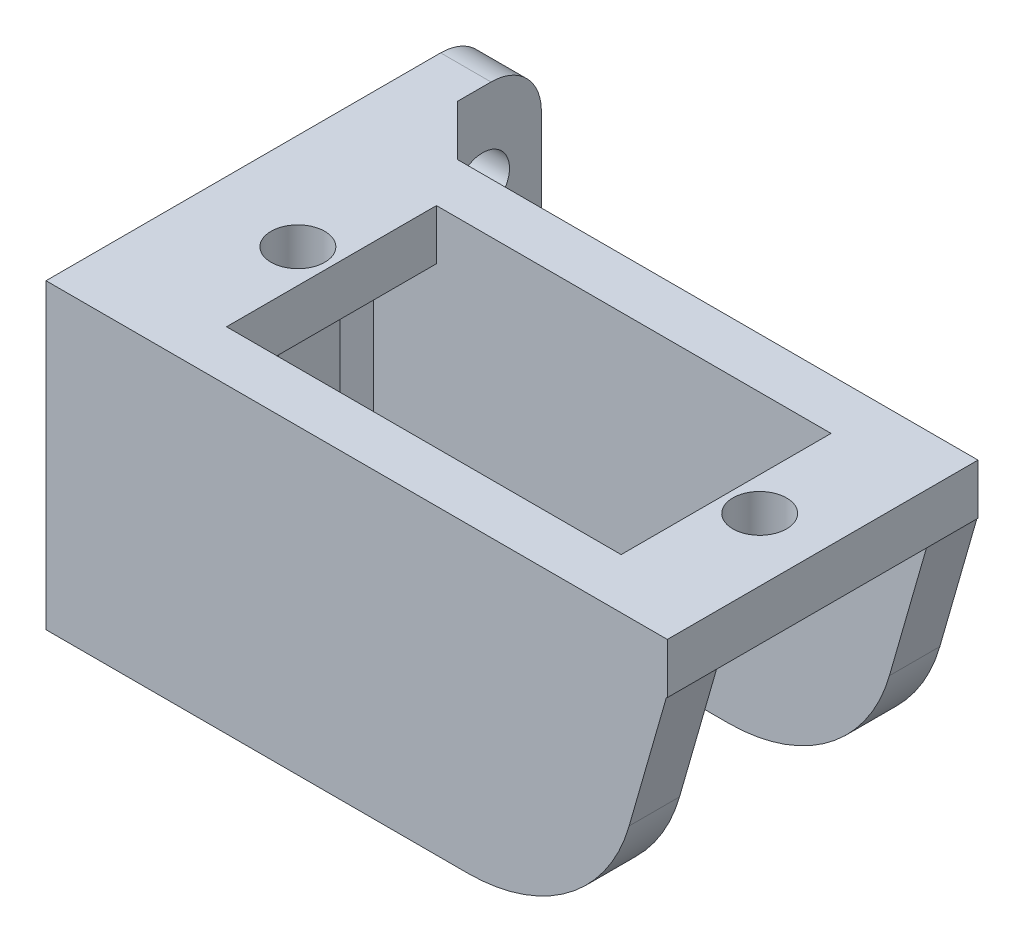
ISO-10303-21;
HEADER;
FILE_DESCRIPTION(('STEP AP214'),'2;1');
FILE_NAME('part.step','',(''),(''),'','','');
FILE_SCHEMA(('AUTOMOTIVE_DESIGN { 1 0 10303 214 1 1 1 1 }'));
ENDSEC;
DATA;
#1=APPLICATION_CONTEXT('core data for automotive mechanical design processes');
#2=APPLICATION_PROTOCOL_DEFINITION('international standard','automotive_design',2000,#1);
#3=PRODUCT_CONTEXT('',#1,'mechanical');
#4=PRODUCT('Part','Part','',(#3));
#5=PRODUCT_RELATED_PRODUCT_CATEGORY('part','',(#4));
#6=PRODUCT_DEFINITION_FORMATION('','',#4);
#7=PRODUCT_DEFINITION_CONTEXT('part definition',#1,'design');
#8=PRODUCT_DEFINITION('design','',#6,#7);
#9=PRODUCT_DEFINITION_SHAPE('','',#8);
#10=(LENGTH_UNIT() NAMED_UNIT(*) SI_UNIT(.MILLI.,.METRE.));
#11=(NAMED_UNIT(*) PLANE_ANGLE_UNIT() SI_UNIT($,.RADIAN.));
#12=(NAMED_UNIT(*) SI_UNIT($,.STERADIAN.) SOLID_ANGLE_UNIT());
#13=UNCERTAINTY_MEASURE_WITH_UNIT(LENGTH_MEASURE(1.E-05),#10,'distance_accuracy_value','');
#14=(GEOMETRIC_REPRESENTATION_CONTEXT(3) GLOBAL_UNCERTAINTY_ASSIGNED_CONTEXT((#13)) GLOBAL_UNIT_ASSIGNED_CONTEXT((#10,
#11,#12)) REPRESENTATION_CONTEXT('',''));
#15=CARTESIAN_POINT('',(0.,0.,0.));
#16=DIRECTION('',(0.,0.,1.));
#17=DIRECTION('',(1.,0.,0.));
#18=AXIS2_PLACEMENT_3D('',#15,#16,#17);
#19=CARTESIAN_POINT('',(0.999999999999997,3.,-21.5));
#20=DIRECTION('',(0.707106781186551,0.,-0.707106781186544));
#21=DIRECTION('',(0.,1.,0.));
#22=AXIS2_PLACEMENT_3D('',#19,#20,#21);
#23=PLANE('',#22);
#24=CARTESIAN_POINT('',(-0.499999999999959,-2.,-23.));
#25=DIRECTION('',(0.707106781186551,0.,-0.707106781186544));
#26=DIRECTION('',(-0.707106781186544,0.,-0.707106781186551));
#27=AXIS2_PLACEMENT_3D('',#24,#25,#26);
#28=ELLIPSE('',#27,3.53553390593272,2.5);
#29=CARTESIAN_POINT('',(0.999999999999997,0.,-21.5));
#30=VERTEX_POINT('',#29);
#31=CARTESIAN_POINT('',(0.999999999999997,-4.00000000000002,-21.5));
#32=VERTEX_POINT('',#31);
#33=EDGE_CURVE('E214',#30,#32,#28,.T.);
#34=ORIENTED_EDGE('',*,*,#33,.F.);
#35=DIRECTION('',(0.,-1.,0.));
#36=VECTOR('',#35,1.);
#37=CARTESIAN_POINT('',(0.999999999999997,-15.,-21.5));
#38=LINE('',#37,#36);
#39=CARTESIAN_POINT('',(0.999999999999997,3.,-21.5));
#40=VERTEX_POINT('',#39);
#41=EDGE_CURVE('E225',#40,#30,#38,.T.);
#42=ORIENTED_EDGE('',*,*,#41,.F.);
#43=DIRECTION('',(0.707106781186544,0.,0.707106781186551));
#44=VECTOR('',#43,1.);
#45=CARTESIAN_POINT('',(11.25,3.,-11.2499999999999));
#46=LINE('',#45,#44);
#47=CARTESIAN_POINT('',(4.,3.,-18.5));
#48=VERTEX_POINT('',#47);
#49=EDGE_CURVE('E391',#48,#40,#46,.F.);
#50=ORIENTED_EDGE('',*,*,#49,.F.);
#51=DIRECTION('',(0.,1.,0.));
#52=VECTOR('',#51,1.);
#53=CARTESIAN_POINT('',(4.,3.,-18.5));
#54=LINE('',#53,#52);
#55=CARTESIAN_POINT('',(4.,-15.,-18.5));
#56=VERTEX_POINT('',#55);
#57=EDGE_CURVE('E237',#56,#48,#54,.T.);
#58=ORIENTED_EDGE('',*,*,#57,.F.);
#59=DIRECTION('',(-0.707106781186544,0.,-0.707106781186551));
#60=VECTOR('',#59,1.);
#61=CARTESIAN_POINT('',(11.25,-15.,-11.2499999999999));
#62=LINE('',#61,#60);
#63=CARTESIAN_POINT('',(0.999999999999997,-15.,-21.5));
#64=VERTEX_POINT('',#63);
#65=EDGE_CURVE('E240',#64,#56,#62,.F.);
#66=ORIENTED_EDGE('',*,*,#65,.F.);
#67=CARTESIAN_POINT('',(0.999999999999997,-12.,-21.5));
#68=VERTEX_POINT('',#67);
#69=EDGE_CURVE('E239',#68,#64,#38,.T.);
#70=ORIENTED_EDGE('',*,*,#69,.F.);
#71=CARTESIAN_POINT('',(-0.499999999999959,-10.,-23.));
#72=DIRECTION('',(0.707106781186551,0.,-0.707106781186544));
#73=DIRECTION('',(-0.707106781186544,0.,-0.707106781186551));
#74=AXIS2_PLACEMENT_3D('',#71,#72,#73);
#75=ELLIPSE('',#74,3.53553390593272,2.5);
#76=CARTESIAN_POINT('',(0.999999999999997,-7.99999999999998,-21.5));
#77=VERTEX_POINT('',#76);
#78=EDGE_CURVE('E229',#77,#68,#75,.T.);
#79=ORIENTED_EDGE('',*,*,#78,.F.);
#80=EDGE_CURVE('E227',#32,#77,#38,.T.);
#81=ORIENTED_EDGE('',*,*,#80,.F.);
#82=EDGE_LOOP('',(#34,#42,#50,#58,#66,#70,#79,#81));
#83=FACE_BOUND('',#82,.T.);
#84=ADVANCED_FACE('F43',(#83),#23,.T.);
#85=CARTESIAN_POINT('',(-2.,-10.,-23.));
#86=DIRECTION('',(1.,0.,0.));
#87=DIRECTION('',(0.,0.,-1.));
#88=AXIS2_PLACEMENT_3D('',#85,#86,#87);
#89=CYLINDRICAL_SURFACE('',#88,1.6);
#90=CARTESIAN_POINT('',(-2.,-10.,-23.));
#91=DIRECTION('',(1.,0.,0.));
#92=DIRECTION('',(0.,0.,-1.));
#93=AXIS2_PLACEMENT_3D('',#90,#91,#92);
#94=CIRCLE('',#93,1.6);
#95=CARTESIAN_POINT('',(-2.,-10.,-24.6));
#96=VERTEX_POINT('',#95);
#97=EDGE_CURVE('E219',#96,#96,#94,.T.);
#98=ORIENTED_EDGE('',*,*,#97,.F.);
#99=EDGE_LOOP('',(#98));
#100=FACE_BOUND('',#99,.T.);
#101=CARTESIAN_POINT('',(0.999999999999997,-10.,-23.));
#102=DIRECTION('',(-1.,0.,0.));
#103=DIRECTION('',(0.,0.,1.));
#104=AXIS2_PLACEMENT_3D('',#101,#102,#103);
#105=CIRCLE('',#104,1.6);
#106=CARTESIAN_POINT('',(0.999999999999997,-10.,-21.4));
#107=VERTEX_POINT('',#106);
#108=EDGE_CURVE('E380',#107,#107,#105,.T.);
#109=ORIENTED_EDGE('',*,*,#108,.F.);
#110=EDGE_LOOP('',(#109));
#111=FACE_BOUND('',#110,.T.);
#112=ADVANCED_FACE('F475',(#100,#111),#89,.F.);
#113=CARTESIAN_POINT('',(-2.,-2.,-23.));
#114=DIRECTION('',(1.,0.,0.));
#115=DIRECTION('',(0.,0.,-1.));
#116=AXIS2_PLACEMENT_3D('',#113,#114,#115);
#117=CYLINDRICAL_SURFACE('',#116,1.6);
#118=CARTESIAN_POINT('',(-2.,-2.,-23.));
#119=DIRECTION('',(1.,0.,0.));
#120=DIRECTION('',(0.,0.,-1.));
#121=AXIS2_PLACEMENT_3D('',#118,#119,#120);
#122=CIRCLE('',#121,1.6);
#123=CARTESIAN_POINT('',(-2.,-2.,-24.6));
#124=VERTEX_POINT('',#123);
#125=EDGE_CURVE('E383',#124,#124,#122,.T.);
#126=ORIENTED_EDGE('',*,*,#125,.F.);
#127=EDGE_LOOP('',(#126));
#128=FACE_BOUND('',#127,.T.);
#129=CARTESIAN_POINT('',(0.999999999999997,-2.,-23.));
#130=DIRECTION('',(-1.,0.,0.));
#131=DIRECTION('',(0.,0.,1.));
#132=AXIS2_PLACEMENT_3D('',#129,#130,#131);
#133=CIRCLE('',#132,1.6);
#134=CARTESIAN_POINT('',(0.999999999999997,-2.,-21.4));
#135=VERTEX_POINT('',#134);
#136=EDGE_CURVE('E377',#135,#135,#133,.T.);
#137=ORIENTED_EDGE('',*,*,#136,.F.);
#138=EDGE_LOOP('',(#137));
#139=FACE_BOUND('',#138,.T.);
#140=ADVANCED_FACE('F481',(#128,#139),#117,.F.);
#141=CARTESIAN_POINT('',(0.,3.,-18.5));
#142=DIRECTION('',(0.,0.,1.));
#143=DIRECTION('',(1.,0.,0.));
#144=AXIS2_PLACEMENT_3D('',#141,#142,#143);
#145=PLANE('',#144);
#146=DIRECTION('',(-0.275637355816996,-0.96126169593832,0.));
#147=VECTOR('',#146,1.);
#148=CARTESIAN_POINT('',(33.0895193766835,-6.48826699824057,-18.5));
#149=LINE('',#148,#147);
#150=CARTESIAN_POINT('',(34.9500000000001,0.,-18.5));
#151=VERTEX_POINT('',#150);
#152=CARTESIAN_POINT('',(32.7258956719733,-7.75637355816996,-18.5));
#153=VERTEX_POINT('',#152);
#154=EDGE_CURVE('E254',#151,#153,#149,.T.);
#155=ORIENTED_EDGE('',*,*,#154,.T.);
#156=CARTESIAN_POINT('',(23.1132787125901,-5.,-18.5));
#157=DIRECTION('',(0.,0.,1.));
#158=DIRECTION('',(1.,0.,0.));
#159=AXIS2_PLACEMENT_3D('',#156,#157,#158);
#160=CIRCLE('',#159,10.);
#161=CARTESIAN_POINT('',(23.1132787125901,-15.,-18.5));
#162=VERTEX_POINT('',#161);
#163=EDGE_CURVE('E423',#153,#162,#160,.F.);
#164=ORIENTED_EDGE('',*,*,#163,.T.);
#165=DIRECTION('',(1.,0.,0.));
#166=VECTOR('',#165,1.);
#167=CARTESIAN_POINT('',(29.25,-15.,-18.5));
#168=LINE('',#167,#166);
#169=EDGE_CURVE('E336',#56,#162,#168,.T.);
#170=ORIENTED_EDGE('',*,*,#169,.F.);
#171=ORIENTED_EDGE('',*,*,#57,.T.);
#172=DIRECTION('',(-1.,0.,0.));
#173=VECTOR('',#172,1.);
#174=CARTESIAN_POINT('',(0.,3.,-18.5));
#175=LINE('',#174,#173);
#176=CARTESIAN_POINT('',(35.,3.,-18.5));
#177=VERTEX_POINT('',#176);
#178=EDGE_CURVE('E279',#177,#48,#175,.T.);
#179=ORIENTED_EDGE('',*,*,#178,.F.);
#180=DIRECTION('',(0.,-1.,0.));
#181=VECTOR('',#180,1.);
#182=CARTESIAN_POINT('',(35.,3.,-18.5));
#183=LINE('',#182,#181);
#184=CARTESIAN_POINT('',(35.,0.,-18.5));
#185=VERTEX_POINT('',#184);
#186=EDGE_CURVE('E276',#177,#185,#183,.T.);
#187=ORIENTED_EDGE('',*,*,#186,.T.);
#188=DIRECTION('',(-1.,0.,0.));
#189=VECTOR('',#188,1.);
#190=CARTESIAN_POINT('',(0.,0.,-18.5));
#191=LINE('',#190,#189);
#192=EDGE_CURVE('E280',#185,#151,#191,.T.);
#193=ORIENTED_EDGE('',*,*,#192,.T.);
#194=EDGE_LOOP('',(#155,#164,#170,#171,#179,#187,#193));
#195=FACE_BOUND('',#194,.T.);
#196=ADVANCED_FACE('F544',(#195),#145,.F.);
#197=CARTESIAN_POINT('',(0.,0.,0.));
#198=DIRECTION('',(0.,-1.,0.));
#199=DIRECTION('',(0.,0.,-1.));
#200=AXIS2_PLACEMENT_3D('',#197,#198,#199);
#201=PLANE('',#200);
#202=DIRECTION('',(0.,0.,-1.));
#203=VECTOR('',#202,1.);
#204=CARTESIAN_POINT('',(29.25,0.,-15.5));
#205=LINE('',#204,#203);
#206=CARTESIAN_POINT('',(29.25,0.,-3.));
#207=VERTEX_POINT('',#206);
#208=CARTESIAN_POINT('',(29.25,0.,-15.5));
#209=VERTEX_POINT('',#208);
#210=EDGE_CURVE('E298',#207,#209,#205,.T.);
#211=ORIENTED_EDGE('',*,*,#210,.T.);
#212=DIRECTION('',(1.,0.,0.));
#213=VECTOR('',#212,1.);
#214=CARTESIAN_POINT('',(0.,0.,-15.5));
#215=LINE('',#214,#213);
#216=CARTESIAN_POINT('',(34.9500000000001,0.,-15.5));
#217=VERTEX_POINT('',#216);
#218=EDGE_CURVE('E261',#209,#217,#215,.T.);
#219=ORIENTED_EDGE('',*,*,#218,.T.);
#220=DIRECTION('',(0.,0.,-1.));
#221=VECTOR('',#220,1.);
#222=CARTESIAN_POINT('',(34.9500000000001,0.,0.));
#223=LINE('',#222,#221);
#224=EDGE_CURVE('E264',#217,#151,#223,.T.);
#225=ORIENTED_EDGE('',*,*,#224,.T.);
#226=ORIENTED_EDGE('',*,*,#192,.F.);
#227=DIRECTION('',(0.,0.,-1.));
#228=VECTOR('',#227,1.);
#229=CARTESIAN_POINT('',(35.,0.,0.));
#230=LINE('',#229,#228);
#231=CARTESIAN_POINT('',(35.,0.,0.));
#232=VERTEX_POINT('',#231);
#233=EDGE_CURVE('E284',#232,#185,#230,.T.);
#234=ORIENTED_EDGE('',*,*,#233,.F.);
#235=DIRECTION('',(1.,0.,0.));
#236=VECTOR('',#235,1.);
#237=CARTESIAN_POINT('',(0.,0.,0.));
#238=LINE('',#237,#236);
#239=CARTESIAN_POINT('',(34.9500000000001,0.,0.));
#240=VERTEX_POINT('',#239);
#241=EDGE_CURVE('E286',#240,#232,#238,.T.);
#242=ORIENTED_EDGE('',*,*,#241,.F.);
#243=DIRECTION('',(0.,0.,-1.));
#244=VECTOR('',#243,1.);
#245=CARTESIAN_POINT('',(34.9500000000001,0.,0.));
#246=LINE('',#245,#244);
#247=CARTESIAN_POINT('',(34.9500000000001,0.,-3.));
#248=VERTEX_POINT('',#247);
#249=EDGE_CURVE('E267',#240,#248,#246,.T.);
#250=ORIENTED_EDGE('',*,*,#249,.T.);
#251=DIRECTION('',(-1.,0.,0.));
#252=VECTOR('',#251,1.);
#253=CARTESIAN_POINT('',(0.,0.,-3.));
#254=LINE('',#253,#252);
#255=EDGE_CURVE('E270',#248,#207,#254,.T.);
#256=ORIENTED_EDGE('',*,*,#255,.T.);
#257=EDGE_LOOP('',(#211,#219,#225,#226,#234,#242,#250,#256));
#258=FACE_BOUND('',#257,.T.);
#259=CARTESIAN_POINT('',(31.25,0.,-9.25));
#260=DIRECTION('',(0.,1.,0.));
#261=DIRECTION('',(0.,0.,1.));
#262=AXIS2_PLACEMENT_3D('',#259,#260,#261);
#263=CIRCLE('',#262,1.6);
#264=CARTESIAN_POINT('',(31.25,0.,-7.65));
#265=VERTEX_POINT('',#264);
#266=EDGE_CURVE('E320',#265,#265,#263,.T.);
#267=ORIENTED_EDGE('',*,*,#266,.T.);
#268=EDGE_LOOP('',(#267));
#269=FACE_BOUND('',#268,.T.);
#270=ADVANCED_FACE('F554',(#258,#269),#201,.T.);
#271=CARTESIAN_POINT('',(0.,3.,0.));
#272=DIRECTION('',(0.,0.,-1.));
#273=DIRECTION('',(-1.,0.,0.));
#274=AXIS2_PLACEMENT_3D('',#271,#272,#273);
#275=PLANE('',#274);
#276=DIRECTION('',(-1.,0.,0.));
#277=VECTOR('',#276,1.);
#278=CARTESIAN_POINT('',(29.25,-15.,0.));
#279=LINE('',#278,#277);
#280=CARTESIAN_POINT('',(23.1132787125901,-15.,0.));
#281=VERTEX_POINT('',#280);
#282=CARTESIAN_POINT('',(-2.,-15.,0.));
#283=VERTEX_POINT('',#282);
#284=EDGE_CURVE('E350',#281,#283,#279,.T.);
#285=ORIENTED_EDGE('',*,*,#284,.F.);
#286=CARTESIAN_POINT('',(23.1132787125901,-5.,0.));
#287=DIRECTION('',(0.,0.,-1.));
#288=DIRECTION('',(-1.,0.,0.));
#289=AXIS2_PLACEMENT_3D('',#286,#287,#288);
#290=CIRCLE('',#289,10.);
#291=CARTESIAN_POINT('',(32.7258956719733,-7.75637355816996,0.));
#292=VERTEX_POINT('',#291);
#293=EDGE_CURVE('E425',#281,#292,#290,.F.);
#294=ORIENTED_EDGE('',*,*,#293,.T.);
#295=DIRECTION('',(0.275637355816996,0.96126169593832,0.));
#296=VECTOR('',#295,1.);
#297=CARTESIAN_POINT('',(33.0895193766835,-6.48826699824057,0.));
#298=LINE('',#297,#296);
#299=EDGE_CURVE('E249',#292,#240,#298,.T.);
#300=ORIENTED_EDGE('',*,*,#299,.T.);
#301=ORIENTED_EDGE('',*,*,#241,.T.);
#302=DIRECTION('',(0.,-1.,0.));
#303=VECTOR('',#302,1.);
#304=CARTESIAN_POINT('',(35.,3.,0.));
#305=LINE('',#304,#303);
#306=CARTESIAN_POINT('',(35.,3.,0.));
#307=VERTEX_POINT('',#306);
#308=EDGE_CURVE('E273',#307,#232,#305,.T.);
#309=ORIENTED_EDGE('',*,*,#308,.F.);
#310=DIRECTION('',(1.,0.,0.));
#311=VECTOR('',#310,1.);
#312=CARTESIAN_POINT('',(0.,3.,0.));
#313=LINE('',#312,#311);
#314=CARTESIAN_POINT('',(-2.,3.,0.));
#315=VERTEX_POINT('',#314);
#316=EDGE_CURVE('E283',#315,#307,#313,.T.);
#317=ORIENTED_EDGE('',*,*,#316,.F.);
#318=DIRECTION('',(0.,1.,0.));
#319=VECTOR('',#318,1.);
#320=CARTESIAN_POINT('',(-2.,0.,0.));
#321=LINE('',#320,#319);
#322=EDGE_CURVE('E324',#283,#315,#321,.T.);
#323=ORIENTED_EDGE('',*,*,#322,.F.);
#324=EDGE_LOOP('',(#285,#294,#300,#301,#309,#317,#323));
#325=FACE_BOUND('',#324,.T.);
#326=ADVANCED_FACE('F520',(#325),#275,.F.);
#327=CARTESIAN_POINT('',(35.,3.,0.));
#328=DIRECTION('',(-1.,0.,0.));
#329=DIRECTION('',(0.,0.,1.));
#330=AXIS2_PLACEMENT_3D('',#327,#328,#329);
#331=PLANE('',#330);
#332=ORIENTED_EDGE('',*,*,#233,.T.);
#333=ORIENTED_EDGE('',*,*,#186,.F.);
#334=DIRECTION('',(0.,0.,-1.));
#335=VECTOR('',#334,1.);
#336=CARTESIAN_POINT('',(35.,3.,0.));
#337=LINE('',#336,#335);
#338=EDGE_CURVE('E291',#307,#177,#337,.T.);
#339=ORIENTED_EDGE('',*,*,#338,.F.);
#340=ORIENTED_EDGE('',*,*,#308,.T.);
#341=EDGE_LOOP('',(#332,#333,#339,#340));
#342=FACE_BOUND('',#341,.T.);
#343=ADVANCED_FACE('F568',(#342),#331,.F.);
#344=CARTESIAN_POINT('',(0.,3.,0.));
#345=DIRECTION('',(0.,-1.,0.));
#346=DIRECTION('',(0.,0.,-1.));
#347=AXIS2_PLACEMENT_3D('',#344,#345,#346);
#348=PLANE('',#347);
#349=CARTESIAN_POINT('',(31.25,3.,-9.25));
#350=DIRECTION('',(0.,1.,0.));
#351=DIRECTION('',(0.,0.,1.));
#352=AXIS2_PLACEMENT_3D('',#349,#350,#351);
#353=CIRCLE('',#352,1.6);
#354=CARTESIAN_POINT('',(31.25,3.,-7.65));
#355=VERTEX_POINT('',#354);
#356=EDGE_CURVE('E323',#355,#355,#353,.T.);
#357=ORIENTED_EDGE('',*,*,#356,.F.);
#358=EDGE_LOOP('',(#357));
#359=FACE_BOUND('',#358,.T.);
#360=CARTESIAN_POINT('',(3.75000000000001,3.,-9.25));
#361=DIRECTION('',(0.,1.,0.));
#362=DIRECTION('',(0.,0.,1.));
#363=AXIS2_PLACEMENT_3D('',#360,#361,#362);
#364=CIRCLE('',#363,1.6);
#365=CARTESIAN_POINT('',(3.75000000000001,3.,-7.65));
#366=VERTEX_POINT('',#365);
#367=EDGE_CURVE('E315',#366,#366,#364,.T.);
#368=ORIENTED_EDGE('',*,*,#367,.F.);
#369=EDGE_LOOP('',(#368));
#370=FACE_BOUND('',#369,.T.);
#371=DIRECTION('',(1.,0.,0.));
#372=VECTOR('',#371,1.);
#373=CARTESIAN_POINT('',(5.75,3.,-3.));
#374=LINE('',#373,#372);
#375=CARTESIAN_POINT('',(5.75,3.,-3.));
#376=VERTEX_POINT('',#375);
#377=CARTESIAN_POINT('',(29.25,3.,-3.));
#378=VERTEX_POINT('',#377);
#379=EDGE_CURVE('E310',#376,#378,#374,.T.);
#380=ORIENTED_EDGE('',*,*,#379,.F.);
#381=DIRECTION('',(0.,0.,1.));
#382=VECTOR('',#381,1.);
#383=CARTESIAN_POINT('',(5.75,3.,-15.5));
#384=LINE('',#383,#382);
#385=CARTESIAN_POINT('',(5.75,3.,-15.5));
#386=VERTEX_POINT('',#385);
#387=EDGE_CURVE('E313',#386,#376,#384,.T.);
#388=ORIENTED_EDGE('',*,*,#387,.F.);
#389=DIRECTION('',(-1.,0.,0.));
#390=VECTOR('',#389,1.);
#391=CARTESIAN_POINT('',(5.75,3.,-15.5));
#392=LINE('',#391,#390);
#393=CARTESIAN_POINT('',(29.25,3.,-15.5));
#394=VERTEX_POINT('',#393);
#395=EDGE_CURVE('E303',#394,#386,#392,.T.);
#396=ORIENTED_EDGE('',*,*,#395,.F.);
#397=DIRECTION('',(0.,0.,-1.));
#398=VECTOR('',#397,1.);
#399=CARTESIAN_POINT('',(29.25,3.,-15.5));
#400=LINE('',#399,#398);
#401=EDGE_CURVE('E307',#378,#394,#400,.T.);
#402=ORIENTED_EDGE('',*,*,#401,.F.);
#403=EDGE_LOOP('',(#380,#388,#396,#402));
#404=FACE_BOUND('',#403,.T.);
#405=DIRECTION('',(0.,0.,1.));
#406=VECTOR('',#405,1.);
#407=CARTESIAN_POINT('',(0.999999999999997,3.,-26.5));
#408=LINE('',#407,#406);
#409=CARTESIAN_POINT('',(0.999999999999997,3.,-23.5));
#410=VERTEX_POINT('',#409);
#411=EDGE_CURVE('E235',#410,#40,#408,.T.);
#412=ORIENTED_EDGE('',*,*,#411,.F.);
#413=DIRECTION('',(1.,0.,0.));
#414=VECTOR('',#413,1.);
#415=CARTESIAN_POINT('',(0.,3.,-23.5));
#416=LINE('',#415,#414);
#417=CARTESIAN_POINT('',(-2.,3.,-23.5));
#418=VERTEX_POINT('',#417);
#419=EDGE_CURVE('E411',#410,#418,#416,.F.);
#420=ORIENTED_EDGE('',*,*,#419,.T.);
#421=DIRECTION('',(0.,0.,1.));
#422=VECTOR('',#421,1.);
#423=CARTESIAN_POINT('',(-2.,3.,0.));
#424=LINE('',#423,#422);
#425=EDGE_CURVE('E334',#418,#315,#424,.T.);
#426=ORIENTED_EDGE('',*,*,#425,.T.);
#427=ORIENTED_EDGE('',*,*,#316,.T.);
#428=ORIENTED_EDGE('',*,*,#338,.T.);
#429=ORIENTED_EDGE('',*,*,#178,.T.);
#430=ORIENTED_EDGE('',*,*,#49,.T.);
#431=EDGE_LOOP('',(#412,#420,#426,#427,#428,#429,#430));
#432=FACE_BOUND('',#431,.T.);
#433=ADVANCED_FACE('F539',(#359,#370,#404,#432),#348,.F.);
#434=DIRECTION('',(0.,0.,1.));
#435=VECTOR('',#434,1.);
#436=CARTESIAN_POINT('',(1.,0.,-15.5));
#437=LINE('',#436,#435);
#438=CARTESIAN_POINT('',(1.,0.,-14.5));
#439=VERTEX_POINT('',#438);
#440=CARTESIAN_POINT('',(1.,0.,-4.00000000000001));
#441=VERTEX_POINT('',#440);
#442=EDGE_CURVE('E340',#439,#441,#437,.T.);
#443=ORIENTED_EDGE('',*,*,#442,.F.);
#444=DIRECTION('',(-0.707106781186545,0.,0.70710678118655));
#445=VECTOR('',#444,1.);
#446=CARTESIAN_POINT('',(-6.74999999999999,0.,-6.74999999999995));
#447=LINE('',#446,#445);
#448=CARTESIAN_POINT('',(1.99999999999999,0.,-15.5));
#449=VERTEX_POINT('',#448);
#450=EDGE_CURVE('E438',#439,#449,#447,.F.);
#451=ORIENTED_EDGE('',*,*,#450,.T.);
#452=DIRECTION('',(-1.,0.,0.));
#453=VECTOR('',#452,1.);
#454=CARTESIAN_POINT('',(29.25,0.,-15.5));
#455=LINE('',#454,#453);
#456=CARTESIAN_POINT('',(5.75,0.,-15.5));
#457=VERTEX_POINT('',#456);
#458=EDGE_CURVE('E272',#457,#449,#455,.T.);
#459=ORIENTED_EDGE('',*,*,#458,.F.);
#460=DIRECTION('',(0.,0.,1.));
#461=VECTOR('',#460,1.);
#462=CARTESIAN_POINT('',(5.75,0.,-15.5));
#463=LINE('',#462,#461);
#464=CARTESIAN_POINT('',(5.75,0.,-3.));
#465=VERTEX_POINT('',#464);
#466=EDGE_CURVE('E306',#457,#465,#463,.T.);
#467=ORIENTED_EDGE('',*,*,#466,.T.);
#468=DIRECTION('',(1.,0.,0.));
#469=VECTOR('',#468,1.);
#470=CARTESIAN_POINT('',(29.25,0.,-3.));
#471=LINE('',#470,#469);
#472=CARTESIAN_POINT('',(2.00000000000002,0.,-3.));
#473=VERTEX_POINT('',#472);
#474=EDGE_CURVE('E337',#473,#465,#471,.T.);
#475=ORIENTED_EDGE('',*,*,#474,.F.);
#476=DIRECTION('',(0.70710678118655,0.,0.707106781186545));
#477=VECTOR('',#476,1.);
#478=CARTESIAN_POINT('',(2.5,0.,-2.50000000000002));
#479=LINE('',#478,#477);
#480=EDGE_CURVE('E436',#473,#441,#479,.F.);
#481=ORIENTED_EDGE('',*,*,#480,.T.);
#482=EDGE_LOOP('',(#443,#451,#459,#467,#475,#481));
#483=FACE_BOUND('',#482,.T.);
#484=CARTESIAN_POINT('',(3.75000000000001,0.,-9.25));
#485=DIRECTION('',(0.,1.,0.));
#486=DIRECTION('',(0.,0.,1.));
#487=AXIS2_PLACEMENT_3D('',#484,#485,#486);
#488=CIRCLE('',#487,1.6);
#489=CARTESIAN_POINT('',(3.75000000000001,0.,-7.65));
#490=VERTEX_POINT('',#489);
#491=EDGE_CURVE('E327',#490,#490,#488,.T.);
#492=ORIENTED_EDGE('',*,*,#491,.T.);
#493=EDGE_LOOP('',(#492));
#494=FACE_BOUND('',#493,.T.);
#495=ADVANCED_FACE('F454',(#483,#494),#201,.T.);
#496=CARTESIAN_POINT('',(5.75,0.,-15.5));
#497=DIRECTION('',(-1.,0.,0.));
#498=DIRECTION('',(0.,0.,1.));
#499=AXIS2_PLACEMENT_3D('',#496,#497,#498);
#500=PLANE('',#499);
#501=ORIENTED_EDGE('',*,*,#387,.T.);
#502=DIRECTION('',(0.,1.,0.));
#503=VECTOR('',#502,1.);
#504=CARTESIAN_POINT('',(5.75,0.,-3.));
#505=LINE('',#504,#503);
#506=EDGE_CURVE('E294',#465,#376,#505,.T.);
#507=ORIENTED_EDGE('',*,*,#506,.F.);
#508=ORIENTED_EDGE('',*,*,#466,.F.);
#509=DIRECTION('',(0.,1.,0.));
#510=VECTOR('',#509,1.);
#511=CARTESIAN_POINT('',(5.75,0.,-15.5));
#512=LINE('',#511,#510);
#513=EDGE_CURVE('E288',#457,#386,#512,.T.);
#514=ORIENTED_EDGE('',*,*,#513,.T.);
#515=EDGE_LOOP('',(#501,#507,#508,#514));
#516=FACE_BOUND('',#515,.T.);
#517=ADVANCED_FACE('F463',(#516),#500,.F.);
#518=CARTESIAN_POINT('',(5.75,0.,-15.5));
#519=DIRECTION('',(0.,0.,-1.));
#520=DIRECTION('',(-1.,0.,0.));
#521=AXIS2_PLACEMENT_3D('',#518,#519,#520);
#522=PLANE('',#521);
#523=ORIENTED_EDGE('',*,*,#458,.T.);
#524=DIRECTION('',(0.,-1.,0.));
#525=VECTOR('',#524,1.);
#526=CARTESIAN_POINT('',(2.,-15.,-15.5));
#527=LINE('',#526,#525);
#528=CARTESIAN_POINT('',(1.99999999999999,-15.,-15.5));
#529=VERTEX_POINT('',#528);
#530=EDGE_CURVE('E65',#449,#529,#527,.T.);
#531=ORIENTED_EDGE('',*,*,#530,.T.);
#532=DIRECTION('',(-1.,0.,0.));
#533=VECTOR('',#532,1.);
#534=CARTESIAN_POINT('',(29.25,-15.,-15.5));
#535=LINE('',#534,#533);
#536=CARTESIAN_POINT('',(23.1132787125901,-15.,-15.5));
#537=VERTEX_POINT('',#536);
#538=EDGE_CURVE('E339',#537,#529,#535,.T.);
#539=ORIENTED_EDGE('',*,*,#538,.F.);
#540=CARTESIAN_POINT('',(23.1132787125901,-5.,-15.5));
#541=DIRECTION('',(0.,0.,-1.));
#542=DIRECTION('',(-1.,0.,0.));
#543=AXIS2_PLACEMENT_3D('',#540,#541,#542);
#544=CIRCLE('',#543,10.);
#545=CARTESIAN_POINT('',(32.7258956719733,-7.75637355816996,-15.5));
#546=VERTEX_POINT('',#545);
#547=EDGE_CURVE('E419',#537,#546,#544,.F.);
#548=ORIENTED_EDGE('',*,*,#547,.T.);
#549=DIRECTION('',(0.275637355816996,0.96126169593832,0.));
#550=VECTOR('',#549,1.);
#551=CARTESIAN_POINT('',(32.731502203884,-7.73682125780476,-15.5));
#552=LINE('',#551,#550);
#553=EDGE_CURVE('E259',#546,#217,#552,.T.);
#554=ORIENTED_EDGE('',*,*,#553,.T.);
#555=ORIENTED_EDGE('',*,*,#218,.F.);
#556=DIRECTION('',(0.,1.,0.));
#557=VECTOR('',#556,1.);
#558=CARTESIAN_POINT('',(29.25,0.,-15.5));
#559=LINE('',#558,#557);
#560=EDGE_CURVE('E300',#209,#394,#559,.T.);
#561=ORIENTED_EDGE('',*,*,#560,.T.);
#562=ORIENTED_EDGE('',*,*,#395,.T.);
#563=ORIENTED_EDGE('',*,*,#513,.F.);
#564=EDGE_LOOP('',(#523,#531,#539,#548,#554,#555,#561,#562,#563));
#565=FACE_BOUND('',#564,.T.);
#566=ADVANCED_FACE('F457',(#565),#522,.F.);
#567=CARTESIAN_POINT('',(29.25,0.,-15.5));
#568=DIRECTION('',(1.,0.,0.));
#569=DIRECTION('',(0.,0.,-1.));
#570=AXIS2_PLACEMENT_3D('',#567,#568,#569);
#571=PLANE('',#570);
#572=ORIENTED_EDGE('',*,*,#401,.T.);
#573=ORIENTED_EDGE('',*,*,#560,.F.);
#574=ORIENTED_EDGE('',*,*,#210,.F.);
#575=DIRECTION('',(0.,1.,0.));
#576=VECTOR('',#575,1.);
#577=CARTESIAN_POINT('',(29.25,0.,-3.));
#578=LINE('',#577,#576);
#579=EDGE_CURVE('E297',#207,#378,#578,.T.);
#580=ORIENTED_EDGE('',*,*,#579,.T.);
#581=EDGE_LOOP('',(#572,#573,#574,#580));
#582=FACE_BOUND('',#581,.T.);
#583=ADVANCED_FACE('F561',(#582),#571,.F.);
#584=CARTESIAN_POINT('',(5.75,0.,-3.));
#585=DIRECTION('',(0.,0.,1.));
#586=DIRECTION('',(1.,0.,0.));
#587=AXIS2_PLACEMENT_3D('',#584,#585,#586);
#588=PLANE('',#587);
#589=DIRECTION('',(1.,0.,0.));
#590=VECTOR('',#589,1.);
#591=CARTESIAN_POINT('',(29.25,-15.,-3.));
#592=LINE('',#591,#590);
#593=CARTESIAN_POINT('',(2.00000000000002,-15.,-3.));
#594=VERTEX_POINT('',#593);
#595=CARTESIAN_POINT('',(23.1132787125901,-15.,-3.));
#596=VERTEX_POINT('',#595);
#597=EDGE_CURVE('E352',#594,#596,#592,.T.);
#598=ORIENTED_EDGE('',*,*,#597,.F.);
#599=DIRECTION('',(0.,1.,0.));
#600=VECTOR('',#599,1.);
#601=CARTESIAN_POINT('',(2.00000000000002,0.,-3.));
#602=LINE('',#601,#600);
#603=EDGE_CURVE('E441',#594,#473,#602,.T.);
#604=ORIENTED_EDGE('',*,*,#603,.T.);
#605=ORIENTED_EDGE('',*,*,#474,.T.);
#606=ORIENTED_EDGE('',*,*,#506,.T.);
#607=ORIENTED_EDGE('',*,*,#379,.T.);
#608=ORIENTED_EDGE('',*,*,#579,.F.);
#609=ORIENTED_EDGE('',*,*,#255,.F.);
#610=DIRECTION('',(-0.275637355816996,-0.96126169593832,0.));
#611=VECTOR('',#610,1.);
#612=CARTESIAN_POINT('',(32.731502203884,-7.73682125780476,-3.));
#613=LINE('',#612,#611);
#614=CARTESIAN_POINT('',(32.7258956719733,-7.75637355816996,-3.));
#615=VERTEX_POINT('',#614);
#616=EDGE_CURVE('E244',#248,#615,#613,.T.);
#617=ORIENTED_EDGE('',*,*,#616,.T.);
#618=CARTESIAN_POINT('',(23.1132787125901,-5.,-3.));
#619=DIRECTION('',(0.,0.,1.));
#620=DIRECTION('',(1.,0.,0.));
#621=AXIS2_PLACEMENT_3D('',#618,#619,#620);
#622=CIRCLE('',#621,10.);
#623=EDGE_CURVE('E429',#615,#596,#622,.F.);
#624=ORIENTED_EDGE('',*,*,#623,.T.);
#625=EDGE_LOOP('',(#598,#604,#605,#606,#607,#608,#609,#617,#624));
#626=FACE_BOUND('',#625,.T.);
#627=ADVANCED_FACE('F465',(#626),#588,.F.);
#628=CARTESIAN_POINT('',(3.75000000000001,0.,-9.25));
#629=DIRECTION('',(0.,1.,0.));
#630=DIRECTION('',(0.,0.,1.));
#631=AXIS2_PLACEMENT_3D('',#628,#629,#630);
#632=CYLINDRICAL_SURFACE('',#631,1.6);
#633=ORIENTED_EDGE('',*,*,#491,.F.);
#634=EDGE_LOOP('',(#633));
#635=FACE_BOUND('',#634,.T.);
#636=ORIENTED_EDGE('',*,*,#367,.T.);
#637=EDGE_LOOP('',(#636));
#638=FACE_BOUND('',#637,.T.);
#639=ADVANCED_FACE('F603',(#635,#638),#632,.F.);
#640=CARTESIAN_POINT('',(31.25,0.,-9.25));
#641=DIRECTION('',(0.,1.,0.));
#642=DIRECTION('',(0.,0.,1.));
#643=AXIS2_PLACEMENT_3D('',#640,#641,#642);
#644=CYLINDRICAL_SURFACE('',#643,1.6);
#645=ORIENTED_EDGE('',*,*,#266,.F.);
#646=EDGE_LOOP('',(#645));
#647=FACE_BOUND('',#646,.T.);
#648=ORIENTED_EDGE('',*,*,#356,.T.);
#649=EDGE_LOOP('',(#648));
#650=FACE_BOUND('',#649,.T.);
#651=ADVANCED_FACE('F601',(#647,#650),#644,.F.);
#652=CARTESIAN_POINT('',(-2.,0.,0.));
#653=DIRECTION('',(-1.,0.,0.));
#654=DIRECTION('',(0.,0.,1.));
#655=AXIS2_PLACEMENT_3D('',#652,#653,#654);
#656=PLANE('',#655);
#657=ORIENTED_EDGE('',*,*,#125,.T.);
#658=EDGE_LOOP('',(#657));
#659=FACE_BOUND('',#658,.T.);
#660=ORIENTED_EDGE('',*,*,#97,.T.);
#661=EDGE_LOOP('',(#660));
#662=FACE_BOUND('',#661,.T.);
#663=CARTESIAN_POINT('',(-2.,-4.6,-9.25));
#664=DIRECTION('',(1.,0.,0.));
#665=DIRECTION('',(0.,0.,-1.));
#666=AXIS2_PLACEMENT_3D('',#663,#664,#665);
#667=CIRCLE('',#666,1.6);
#668=CARTESIAN_POINT('',(-2.,-4.6,-10.85));
#669=VERTEX_POINT('',#668);
#670=EDGE_CURVE('E343',#669,#669,#667,.T.);
#671=ORIENTED_EDGE('',*,*,#670,.T.);
#672=EDGE_LOOP('',(#671));
#673=FACE_BOUND('',#672,.T.);
#674=CARTESIAN_POINT('',(-2.,-11.4,-9.25));
#675=DIRECTION('',(1.,0.,0.));
#676=DIRECTION('',(0.,0.,-1.));
#677=AXIS2_PLACEMENT_3D('',#674,#675,#676);
#678=CIRCLE('',#677,1.6);
#679=CARTESIAN_POINT('',(-2.,-11.4,-10.85));
#680=VERTEX_POINT('',#679);
#681=EDGE_CURVE('E357',#680,#680,#678,.T.);
#682=ORIENTED_EDGE('',*,*,#681,.T.);
#683=EDGE_LOOP('',(#682));
#684=FACE_BOUND('',#683,.T.);
#685=DIRECTION('',(0.,1.,0.));
#686=VECTOR('',#685,1.);
#687=CARTESIAN_POINT('',(-2.,3.,-26.5));
#688=LINE('',#687,#686);
#689=CARTESIAN_POINT('',(-2.,-12.,-26.5));
#690=VERTEX_POINT('',#689);
#691=CARTESIAN_POINT('',(-2.,0.,-26.5));
#692=VERTEX_POINT('',#691);
#693=EDGE_CURVE('E374',#690,#692,#688,.T.);
#694=ORIENTED_EDGE('',*,*,#693,.F.);
#695=CARTESIAN_POINT('',(-2.,-12.,-23.5));
#696=DIRECTION('',(-1.,0.,0.));
#697=DIRECTION('',(0.,0.,1.));
#698=AXIS2_PLACEMENT_3D('',#695,#696,#697);
#699=CIRCLE('',#698,3.);
#700=CARTESIAN_POINT('',(-2.,-15.,-23.5));
#701=VERTEX_POINT('',#700);
#702=EDGE_CURVE('E403',#690,#701,#699,.T.);
#703=ORIENTED_EDGE('',*,*,#702,.T.);
#704=DIRECTION('',(0.,0.,-1.));
#705=VECTOR('',#704,1.);
#706=CARTESIAN_POINT('',(-2.,-15.,-3.75));
#707=LINE('',#706,#705);
#708=EDGE_CURVE('E347',#283,#701,#707,.T.);
#709=ORIENTED_EDGE('',*,*,#708,.F.);
#710=ORIENTED_EDGE('',*,*,#322,.T.);
#711=ORIENTED_EDGE('',*,*,#425,.F.);
#712=CARTESIAN_POINT('',(-2.,0.,-23.5));
#713=DIRECTION('',(-1.,0.,0.));
#714=DIRECTION('',(0.,0.,1.));
#715=AXIS2_PLACEMENT_3D('',#712,#713,#714);
#716=CIRCLE('',#715,3.);
#717=EDGE_CURVE('E401',#418,#692,#716,.T.);
#718=ORIENTED_EDGE('',*,*,#717,.T.);
#719=EDGE_LOOP('',(#694,#703,#709,#710,#711,#718));
#720=FACE_BOUND('',#719,.T.);
#721=ADVANCED_FACE('F528',(#659,#662,#673,#684,#720),#656,.T.);
#722=CARTESIAN_POINT('',(1.,-15.,-15.5));
#723=DIRECTION('',(-1.,0.,0.));
#724=DIRECTION('',(0.,0.,1.));
#725=AXIS2_PLACEMENT_3D('',#722,#723,#724);
#726=PLANE('',#725);
#727=CARTESIAN_POINT('',(1.,-4.6,-9.25));
#728=DIRECTION('',(1.,0.,0.));
#729=DIRECTION('',(0.,0.,-1.));
#730=AXIS2_PLACEMENT_3D('',#727,#728,#729);
#731=CIRCLE('',#730,1.6);
#732=CARTESIAN_POINT('',(1.,-4.6,-10.85));
#733=VERTEX_POINT('',#732);
#734=EDGE_CURVE('E363',#733,#733,#731,.T.);
#735=ORIENTED_EDGE('',*,*,#734,.F.);
#736=EDGE_LOOP('',(#735));
#737=FACE_BOUND('',#736,.T.);
#738=CARTESIAN_POINT('',(1.,-11.4,-9.25));
#739=DIRECTION('',(1.,0.,0.));
#740=DIRECTION('',(0.,0.,-1.));
#741=AXIS2_PLACEMENT_3D('',#738,#739,#740);
#742=CIRCLE('',#741,1.6);
#743=CARTESIAN_POINT('',(1.,-11.4,-10.85));
#744=VERTEX_POINT('',#743);
#745=EDGE_CURVE('E360',#744,#744,#742,.T.);
#746=ORIENTED_EDGE('',*,*,#745,.F.);
#747=EDGE_LOOP('',(#746));
#748=FACE_BOUND('',#747,.T.);
#749=DIRECTION('',(0.,0.,1.));
#750=VECTOR('',#749,1.);
#751=CARTESIAN_POINT('',(1.,-15.,-15.5));
#752=LINE('',#751,#750);
#753=CARTESIAN_POINT('',(1.,-15.,-14.5));
#754=VERTEX_POINT('',#753);
#755=CARTESIAN_POINT('',(1.,-15.,-4.00000000000001));
#756=VERTEX_POINT('',#755);
#757=EDGE_CURVE('E354',#754,#756,#752,.T.);
#758=ORIENTED_EDGE('',*,*,#757,.F.);
#759=DIRECTION('',(0.,1.,0.));
#760=VECTOR('',#759,1.);
#761=CARTESIAN_POINT('',(1.,0.,-14.5));
#762=LINE('',#761,#760);
#763=EDGE_CURVE('E433',#754,#439,#762,.T.);
#764=ORIENTED_EDGE('',*,*,#763,.T.);
#765=ORIENTED_EDGE('',*,*,#442,.T.);
#766=DIRECTION('',(0.,-1.,0.));
#767=VECTOR('',#766,1.);
#768=CARTESIAN_POINT('',(1.,-15.,-4.00000000000001));
#769=LINE('',#768,#767);
#770=EDGE_CURVE('E431',#441,#756,#769,.T.);
#771=ORIENTED_EDGE('',*,*,#770,.T.);
#772=EDGE_LOOP('',(#758,#764,#765,#771));
#773=FACE_BOUND('',#772,.T.);
#774=ADVANCED_FACE('F449',(#737,#748,#773),#726,.F.);
#775=CARTESIAN_POINT('',(0.,-15.,0.));
#776=DIRECTION('',(0.,1.,0.));
#777=DIRECTION('',(0.,0.,1.));
#778=AXIS2_PLACEMENT_3D('',#775,#776,#777);
#779=PLANE('',#778);
#780=ORIENTED_EDGE('',*,*,#169,.T.);
#781=DIRECTION('',(0.,0.,1.));
#782=VECTOR('',#781,1.);
#783=CARTESIAN_POINT('',(23.1132787125901,-15.,0.));
#784=LINE('',#783,#782);
#785=EDGE_CURVE('E416',#162,#537,#784,.T.);
#786=ORIENTED_EDGE('',*,*,#785,.T.);
#787=ORIENTED_EDGE('',*,*,#538,.T.);
#788=DIRECTION('',(0.707106781186545,0.,-0.70710678118655));
#789=VECTOR('',#788,1.);
#790=CARTESIAN_POINT('',(-6.74999999999999,-15.,-6.74999999999995));
#791=LINE('',#790,#789);
#792=EDGE_CURVE('E52',#529,#754,#791,.F.);
#793=ORIENTED_EDGE('',*,*,#792,.T.);
#794=ORIENTED_EDGE('',*,*,#757,.T.);
#795=DIRECTION('',(-0.70710678118655,0.,-0.707106781186545));
#796=VECTOR('',#795,1.);
#797=CARTESIAN_POINT('',(2.5,-15.,-2.50000000000002));
#798=LINE('',#797,#796);
#799=EDGE_CURVE('E11',#756,#594,#798,.F.);
#800=ORIENTED_EDGE('',*,*,#799,.T.);
#801=ORIENTED_EDGE('',*,*,#597,.T.);
#802=DIRECTION('',(0.,0.,1.));
#803=VECTOR('',#802,1.);
#804=CARTESIAN_POINT('',(23.1132787125901,-15.,0.));
#805=LINE('',#804,#803);
#806=EDGE_CURVE('E413',#596,#281,#805,.T.);
#807=ORIENTED_EDGE('',*,*,#806,.T.);
#808=ORIENTED_EDGE('',*,*,#284,.T.);
#809=ORIENTED_EDGE('',*,*,#708,.T.);
#810=DIRECTION('',(-1.,0.,0.));
#811=VECTOR('',#810,1.);
#812=CARTESIAN_POINT('',(0.,-15.,-23.5));
#813=LINE('',#812,#811);
#814=CARTESIAN_POINT('',(0.999999999999997,-15.,-23.5));
#815=VERTEX_POINT('',#814);
#816=EDGE_CURVE('E405',#701,#815,#813,.F.);
#817=ORIENTED_EDGE('',*,*,#816,.T.);
#818=DIRECTION('',(0.,0.,1.));
#819=VECTOR('',#818,1.);
#820=CARTESIAN_POINT('',(0.999999999999997,-15.,-26.5));
#821=LINE('',#820,#819);
#822=EDGE_CURVE('E369',#815,#64,#821,.T.);
#823=ORIENTED_EDGE('',*,*,#822,.T.);
#824=ORIENTED_EDGE('',*,*,#65,.T.);
#825=EDGE_LOOP('',(#780,#786,#787,#793,#794,#800,#801,#807,#808,#809,#817,#823,#824));
#826=FACE_BOUND('',#825,.T.);
#827=ADVANCED_FACE('F445',(#826),#779,.F.);
#828=CARTESIAN_POINT('',(29.25,-19.8782623298939,-15.5));
#829=DIRECTION('',(-0.96126169593832,0.275637355816996,0.));
#830=DIRECTION('',(0.,0.,1.));
#831=AXIS2_PLACEMENT_3D('',#828,#829,#830);
#832=PLANE('',#831);
#833=ORIENTED_EDGE('',*,*,#553,.F.);
#834=DIRECTION('',(0.,0.,1.));
#835=VECTOR('',#834,1.);
#836=CARTESIAN_POINT('',(32.7258956719733,-7.75637355816997,-15.5));
#837=LINE('',#836,#835);
#838=EDGE_CURVE('E421',#546,#153,#837,.F.);
#839=ORIENTED_EDGE('',*,*,#838,.T.);
#840=ORIENTED_EDGE('',*,*,#154,.F.);
#841=ORIENTED_EDGE('',*,*,#224,.F.);
#842=EDGE_LOOP('',(#833,#839,#840,#841));
#843=FACE_BOUND('',#842,.T.);
#844=ADVANCED_FACE('F552',(#843),#832,.F.);
#845=CARTESIAN_POINT('',(29.25,-19.8782623298939,-3.));
#846=DIRECTION('',(-0.96126169593832,0.275637355816996,0.));
#847=DIRECTION('',(0.,0.,1.));
#848=AXIS2_PLACEMENT_3D('',#845,#846,#847);
#849=PLANE('',#848);
#850=ORIENTED_EDGE('',*,*,#299,.F.);
#851=DIRECTION('',(0.,0.,1.));
#852=VECTOR('',#851,1.);
#853=CARTESIAN_POINT('',(32.7258956719733,-7.75637355816997,-3.));
#854=LINE('',#853,#852);
#855=EDGE_CURVE('E427',#292,#615,#854,.F.);
#856=ORIENTED_EDGE('',*,*,#855,.T.);
#857=ORIENTED_EDGE('',*,*,#616,.F.);
#858=ORIENTED_EDGE('',*,*,#249,.F.);
#859=EDGE_LOOP('',(#850,#856,#857,#858));
#860=FACE_BOUND('',#859,.T.);
#861=ADVANCED_FACE('F491',(#860),#849,.F.);
#862=CARTESIAN_POINT('',(-2.,-11.4,-9.25));
#863=DIRECTION('',(1.,0.,0.));
#864=DIRECTION('',(0.,0.,-1.));
#865=AXIS2_PLACEMENT_3D('',#862,#863,#864);
#866=CYLINDRICAL_SURFACE('',#865,1.6);
#867=ORIENTED_EDGE('',*,*,#681,.F.);
#868=EDGE_LOOP('',(#867));
#869=FACE_BOUND('',#868,.T.);
#870=ORIENTED_EDGE('',*,*,#745,.T.);
#871=EDGE_LOOP('',(#870));
#872=FACE_BOUND('',#871,.T.);
#873=ADVANCED_FACE('F588',(#869,#872),#866,.F.);
#874=CARTESIAN_POINT('',(-2.,-4.6,-9.25));
#875=DIRECTION('',(1.,0.,0.));
#876=DIRECTION('',(0.,0.,-1.));
#877=AXIS2_PLACEMENT_3D('',#874,#875,#876);
#878=CYLINDRICAL_SURFACE('',#877,1.6);
#879=ORIENTED_EDGE('',*,*,#670,.F.);
#880=EDGE_LOOP('',(#879));
#881=FACE_BOUND('',#880,.T.);
#882=ORIENTED_EDGE('',*,*,#734,.T.);
#883=EDGE_LOOP('',(#882));
#884=FACE_BOUND('',#883,.T.);
#885=ADVANCED_FACE('F639',(#881,#884),#878,.F.);
#886=CARTESIAN_POINT('',(0.999999999999997,3.,-26.5));
#887=DIRECTION('',(-1.,0.,0.));
#888=DIRECTION('',(0.,0.,1.));
#889=AXIS2_PLACEMENT_3D('',#886,#887,#888);
#890=PLANE('',#889);
#891=ORIENTED_EDGE('',*,*,#822,.F.);
#892=CARTESIAN_POINT('',(0.999999999999997,-12.,-23.5));
#893=DIRECTION('',(-1.,0.,0.));
#894=DIRECTION('',(0.,0.,1.));
#895=AXIS2_PLACEMENT_3D('',#892,#893,#894);
#896=CIRCLE('',#895,3.);
#897=CARTESIAN_POINT('',(0.999999999999997,-12.,-26.5));
#898=VERTEX_POINT('',#897);
#899=EDGE_CURVE('E409',#815,#898,#896,.F.);
#900=ORIENTED_EDGE('',*,*,#899,.T.);
#901=DIRECTION('',(0.,-1.,0.));
#902=VECTOR('',#901,1.);
#903=CARTESIAN_POINT('',(0.999999999999997,3.,-26.5));
#904=LINE('',#903,#902);
#905=CARTESIAN_POINT('',(0.999999999999997,0.,-26.5));
#906=VERTEX_POINT('',#905);
#907=EDGE_CURVE('E371',#906,#898,#904,.T.);
#908=ORIENTED_EDGE('',*,*,#907,.F.);
#909=CARTESIAN_POINT('',(0.999999999999997,0.,-23.5));
#910=DIRECTION('',(-1.,0.,0.));
#911=DIRECTION('',(0.,0.,1.));
#912=AXIS2_PLACEMENT_3D('',#909,#910,#911);
#913=CIRCLE('',#912,3.);
#914=EDGE_CURVE('E407',#906,#410,#913,.F.);
#915=ORIENTED_EDGE('',*,*,#914,.T.);
#916=ORIENTED_EDGE('',*,*,#411,.T.);
#917=ORIENTED_EDGE('',*,*,#41,.T.);
#918=CARTESIAN_POINT('',(0.999999999999997,-2.,-23.));
#919=DIRECTION('',(1.,0.,0.));
#920=DIRECTION('',(0.,0.,-1.));
#921=AXIS2_PLACEMENT_3D('',#918,#919,#920);
#922=CIRCLE('',#921,2.5);
#923=EDGE_CURVE('E211',#30,#32,#922,.T.);
#924=ORIENTED_EDGE('',*,*,#923,.T.);
#925=ORIENTED_EDGE('',*,*,#80,.T.);
#926=CARTESIAN_POINT('',(0.999999999999997,-10.,-23.));
#927=DIRECTION('',(1.,0.,0.));
#928=DIRECTION('',(0.,0.,-1.));
#929=AXIS2_PLACEMENT_3D('',#926,#927,#928);
#930=CIRCLE('',#929,2.5);
#931=EDGE_CURVE('E220',#77,#68,#930,.T.);
#932=ORIENTED_EDGE('',*,*,#931,.T.);
#933=ORIENTED_EDGE('',*,*,#69,.T.);
#934=EDGE_LOOP('',(#891,#900,#908,#915,#916,#917,#924,#925,#932,#933));
#935=FACE_BOUND('',#934,.T.);
#936=ORIENTED_EDGE('',*,*,#108,.T.);
#937=EDGE_LOOP('',(#936));
#938=FACE_BOUND('',#937,.T.);
#939=ORIENTED_EDGE('',*,*,#136,.T.);
#940=EDGE_LOOP('',(#939));
#941=FACE_BOUND('',#940,.T.);
#942=ADVANCED_FACE('F232',(#935,#938,#941),#890,.F.);
#943=CARTESIAN_POINT('',(0.,0.,-26.5));
#944=DIRECTION('',(0.,0.,1.));
#945=DIRECTION('',(1.,0.,0.));
#946=AXIS2_PLACEMENT_3D('',#943,#944,#945);
#947=PLANE('',#946);
#948=ORIENTED_EDGE('',*,*,#907,.T.);
#949=DIRECTION('',(-1.,0.,0.));
#950=VECTOR('',#949,1.);
#951=CARTESIAN_POINT('',(0.,-12.,-26.5));
#952=LINE('',#951,#950);
#953=EDGE_CURVE('E398',#898,#690,#952,.T.);
#954=ORIENTED_EDGE('',*,*,#953,.T.);
#955=ORIENTED_EDGE('',*,*,#693,.T.);
#956=DIRECTION('',(1.,0.,0.));
#957=VECTOR('',#956,1.);
#958=CARTESIAN_POINT('',(0.,0.,-26.5));
#959=LINE('',#958,#957);
#960=EDGE_CURVE('E228',#692,#906,#959,.T.);
#961=ORIENTED_EDGE('',*,*,#960,.T.);
#962=EDGE_LOOP('',(#948,#954,#955,#961));
#963=FACE_BOUND('',#962,.T.);
#964=ADVANCED_FACE('F534',(#963),#947,.F.);
#965=CARTESIAN_POINT('',(35.,-2.,-23.));
#966=DIRECTION('',(-1.,0.,0.));
#967=DIRECTION('',(0.,0.,1.));
#968=AXIS2_PLACEMENT_3D('',#965,#966,#967);
#969=CYLINDRICAL_SURFACE('',#968,2.5);
#970=ORIENTED_EDGE('',*,*,#33,.T.);
#971=ORIENTED_EDGE('',*,*,#923,.F.);
#972=EDGE_LOOP('',(#970,#971));
#973=FACE_BOUND('',#972,.T.);
#974=ADVANCED_FACE('F213',(#973),#969,.F.);
#975=CARTESIAN_POINT('',(35.,-10.,-23.));
#976=DIRECTION('',(-1.,0.,0.));
#977=DIRECTION('',(0.,0.,1.));
#978=AXIS2_PLACEMENT_3D('',#975,#976,#977);
#979=CYLINDRICAL_SURFACE('',#978,2.5);
#980=ORIENTED_EDGE('',*,*,#78,.T.);
#981=ORIENTED_EDGE('',*,*,#931,.F.);
#982=EDGE_LOOP('',(#980,#981));
#983=FACE_BOUND('',#982,.T.);
#984=ADVANCED_FACE('F497',(#983),#979,.F.);
#985=CARTESIAN_POINT('',(0.,-12.,-23.5));
#986=DIRECTION('',(-1.,0.,0.));
#987=DIRECTION('',(0.,0.,1.));
#988=AXIS2_PLACEMENT_3D('',#985,#986,#987);
#989=CYLINDRICAL_SURFACE('',#988,3.);
#990=ORIENTED_EDGE('',*,*,#899,.F.);
#991=ORIENTED_EDGE('',*,*,#816,.F.);
#992=ORIENTED_EDGE('',*,*,#702,.F.);
#993=ORIENTED_EDGE('',*,*,#953,.F.);
#994=EDGE_LOOP('',(#990,#991,#992,#993));
#995=FACE_BOUND('',#994,.T.);
#996=ADVANCED_FACE('F493',(#995),#989,.T.);
#997=CARTESIAN_POINT('',(0.,0.,-23.5));
#998=DIRECTION('',(1.,0.,0.));
#999=DIRECTION('',(0.,0.,-1.));
#1000=AXIS2_PLACEMENT_3D('',#997,#998,#999);
#1001=CYLINDRICAL_SURFACE('',#1000,3.);
#1002=ORIENTED_EDGE('',*,*,#717,.F.);
#1003=ORIENTED_EDGE('',*,*,#419,.F.);
#1004=ORIENTED_EDGE('',*,*,#914,.F.);
#1005=ORIENTED_EDGE('',*,*,#960,.F.);
#1006=EDGE_LOOP('',(#1002,#1003,#1004,#1005));
#1007=FACE_BOUND('',#1006,.T.);
#1008=ADVANCED_FACE('F496',(#1007),#1001,.T.);
#1009=CARTESIAN_POINT('',(23.1132787125901,-5.,0.));
#1010=DIRECTION('',(0.,0.,1.));
#1011=DIRECTION('',(1.,0.,0.));
#1012=AXIS2_PLACEMENT_3D('',#1009,#1010,#1011);
#1013=CYLINDRICAL_SURFACE('',#1012,10.);
#1014=ORIENTED_EDGE('',*,*,#163,.F.);
#1015=ORIENTED_EDGE('',*,*,#838,.F.);
#1016=ORIENTED_EDGE('',*,*,#547,.F.);
#1017=ORIENTED_EDGE('',*,*,#785,.F.);
#1018=EDGE_LOOP('',(#1014,#1015,#1016,#1017));
#1019=FACE_BOUND('',#1018,.T.);
#1020=ADVANCED_FACE('F501',(#1019),#1013,.T.);
#1021=CARTESIAN_POINT('',(23.1132787125901,-5.,0.));
#1022=DIRECTION('',(0.,0.,1.));
#1023=DIRECTION('',(1.,0.,0.));
#1024=AXIS2_PLACEMENT_3D('',#1021,#1022,#1023);
#1025=CYLINDRICAL_SURFACE('',#1024,10.);
#1026=ORIENTED_EDGE('',*,*,#623,.F.);
#1027=ORIENTED_EDGE('',*,*,#855,.F.);
#1028=ORIENTED_EDGE('',*,*,#293,.F.);
#1029=ORIENTED_EDGE('',*,*,#806,.F.);
#1030=EDGE_LOOP('',(#1026,#1027,#1028,#1029));
#1031=FACE_BOUND('',#1030,.T.);
#1032=ADVANCED_FACE('F473',(#1031),#1025,.T.);
#1033=CARTESIAN_POINT('',(1.,-15.,-14.5));
#1034=DIRECTION('',(0.70710678118655,0.,0.707106781186545));
#1035=DIRECTION('',(0.,-1.,0.));
#1036=AXIS2_PLACEMENT_3D('',#1033,#1034,#1035);
#1037=PLANE('',#1036);
#1038=ORIENTED_EDGE('',*,*,#792,.F.);
#1039=ORIENTED_EDGE('',*,*,#530,.F.);
#1040=ORIENTED_EDGE('',*,*,#450,.F.);
#1041=ORIENTED_EDGE('',*,*,#763,.F.);
#1042=EDGE_LOOP('',(#1038,#1039,#1040,#1041));
#1043=FACE_BOUND('',#1042,.T.);
#1044=ADVANCED_FACE('F452',(#1043),#1037,.T.);
#1045=CARTESIAN_POINT('',(2.00000000000002,0.,-3.));
#1046=DIRECTION('',(0.707106781186545,0.,-0.70710678118655));
#1047=DIRECTION('',(0.,-1.,0.));
#1048=AXIS2_PLACEMENT_3D('',#1045,#1046,#1047);
#1049=PLANE('',#1048);
#1050=ORIENTED_EDGE('',*,*,#799,.F.);
#1051=ORIENTED_EDGE('',*,*,#770,.F.);
#1052=ORIENTED_EDGE('',*,*,#480,.F.);
#1053=ORIENTED_EDGE('',*,*,#603,.F.);
#1054=EDGE_LOOP('',(#1050,#1051,#1052,#1053));
#1055=FACE_BOUND('',#1054,.T.);
#1056=ADVANCED_FACE('F46',(#1055),#1049,.T.);
#1057=CLOSED_SHELL('',(#84,#112,#140,#196,#270,#326,#343,#433,#495,#517,#566,#583,#627,#639,
#651,#721,#774,#827,#844,#861,#873,#885,#942,#964,#974,#984,#996,#1008,#1020,#1032,#1044,#1056));
#1058=MANIFOLD_SOLID_BREP('B2',#1057);
#1059=ADVANCED_BREP_SHAPE_REPRESENTATION('',(#18,#1058),#14);
#1060=SHAPE_DEFINITION_REPRESENTATION(#9,#1059);
ENDSEC;
END-ISO-10303-21;
